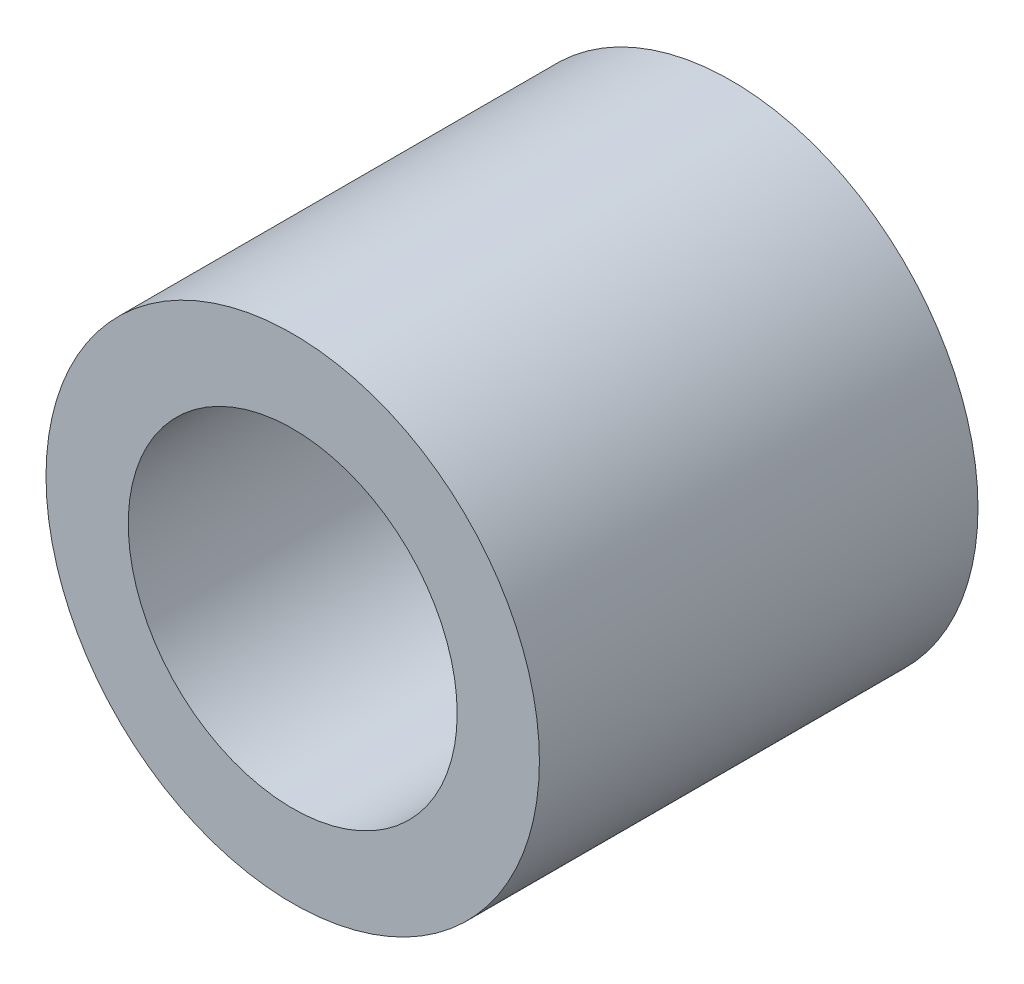
ISO-10303-21;
HEADER;
FILE_DESCRIPTION(('STEP AP214'),'2;1');
FILE_NAME('part.step','',(''),(''),'','','');
FILE_SCHEMA(('AUTOMOTIVE_DESIGN { 1 0 10303 214 1 1 1 1 }'));
ENDSEC;
DATA;
#1=APPLICATION_CONTEXT('core data for automotive mechanical design processes');
#2=APPLICATION_PROTOCOL_DEFINITION('international standard','automotive_design',2000,#1);
#3=PRODUCT_CONTEXT('',#1,'mechanical');
#4=PRODUCT('Part','Part','',(#3));
#5=PRODUCT_RELATED_PRODUCT_CATEGORY('part','',(#4));
#6=PRODUCT_DEFINITION_FORMATION('','',#4);
#7=PRODUCT_DEFINITION_CONTEXT('part definition',#1,'design');
#8=PRODUCT_DEFINITION('design','',#6,#7);
#9=PRODUCT_DEFINITION_SHAPE('','',#8);
#10=(LENGTH_UNIT() NAMED_UNIT(*) SI_UNIT(.MILLI.,.METRE.));
#11=(NAMED_UNIT(*) PLANE_ANGLE_UNIT() SI_UNIT($,.RADIAN.));
#12=(NAMED_UNIT(*) SI_UNIT($,.STERADIAN.) SOLID_ANGLE_UNIT());
#13=UNCERTAINTY_MEASURE_WITH_UNIT(LENGTH_MEASURE(1.E-05),#10,'distance_accuracy_value','');
#14=(GEOMETRIC_REPRESENTATION_CONTEXT(3) GLOBAL_UNCERTAINTY_ASSIGNED_CONTEXT((#13)) GLOBAL_UNIT_ASSIGNED_CONTEXT((#10,
#11,#12)) REPRESENTATION_CONTEXT('',''));
#15=CARTESIAN_POINT('',(0.,0.,0.));
#16=DIRECTION('',(0.,0.,1.));
#17=DIRECTION('',(1.,0.,0.));
#18=AXIS2_PLACEMENT_3D('',#15,#16,#17);
#19=CARTESIAN_POINT('',(0.,0.,0.));
#20=DIRECTION('',(0.,0.,1.));
#21=DIRECTION('',(1.,0.,0.));
#22=AXIS2_PLACEMENT_3D('',#19,#20,#21);
#23=CYLINDRICAL_SURFACE('',#22,6.);
#24=CARTESIAN_POINT('',(0.,0.,16.));
#25=DIRECTION('',(0.,0.,1.));
#26=DIRECTION('',(1.,0.,0.));
#27=AXIS2_PLACEMENT_3D('',#24,#25,#26);
#28=CIRCLE('',#27,6.);
#29=CARTESIAN_POINT('',(6.,0.,16.));
#30=VERTEX_POINT('',#29);
#31=EDGE_CURVE('E18',#30,#30,#28,.F.);
#32=ORIENTED_EDGE('',*,*,#31,.F.);
#33=EDGE_LOOP('',(#32));
#34=FACE_BOUND('',#33,.T.);
#35=CARTESIAN_POINT('',(0.,0.,0.));
#36=DIRECTION('',(0.,0.,1.));
#37=DIRECTION('',(1.,0.,0.));
#38=AXIS2_PLACEMENT_3D('',#35,#36,#37);
#39=CIRCLE('',#38,6.);
#40=CARTESIAN_POINT('',(6.,0.,0.));
#41=VERTEX_POINT('',#40);
#42=EDGE_CURVE('E27',#41,#41,#39,.F.);
#43=ORIENTED_EDGE('',*,*,#42,.T.);
#44=EDGE_LOOP('',(#43));
#45=FACE_BOUND('',#44,.T.);
#46=ADVANCED_FACE('F15',(#34,#45),#23,.F.);
#47=CARTESIAN_POINT('',(0.,0.,16.));
#48=DIRECTION('',(0.,0.,1.));
#49=DIRECTION('',(1.,0.,0.));
#50=AXIS2_PLACEMENT_3D('',#47,#48,#49);
#51=PLANE('',#50);
#52=ORIENTED_EDGE('',*,*,#31,.T.);
#53=EDGE_LOOP('',(#52));
#54=FACE_BOUND('',#53,.T.);
#55=CARTESIAN_POINT('',(0.,0.,16.));
#56=DIRECTION('',(0.,0.,1.));
#57=DIRECTION('',(1.,0.,0.));
#58=AXIS2_PLACEMENT_3D('',#55,#56,#57);
#59=CIRCLE('',#58,9.);
#60=CARTESIAN_POINT('',(9.,0.,16.));
#61=VERTEX_POINT('',#60);
#62=EDGE_CURVE('E22',#61,#61,#59,.F.);
#63=ORIENTED_EDGE('',*,*,#62,.F.);
#64=EDGE_LOOP('',(#63));
#65=FACE_BOUND('',#64,.T.);
#66=ADVANCED_FACE('F35',(#54,#65),#51,.T.);
#67=CARTESIAN_POINT('',(0.,0.,0.));
#68=DIRECTION('',(0.,0.,1.));
#69=DIRECTION('',(1.,0.,0.));
#70=AXIS2_PLACEMENT_3D('',#67,#68,#69);
#71=PLANE('',#70);
#72=ORIENTED_EDGE('',*,*,#42,.F.);
#73=EDGE_LOOP('',(#72));
#74=FACE_BOUND('',#73,.T.);
#75=CARTESIAN_POINT('',(0.,0.,0.));
#76=DIRECTION('',(0.,0.,1.));
#77=DIRECTION('',(1.,0.,0.));
#78=AXIS2_PLACEMENT_3D('',#75,#76,#77);
#79=CIRCLE('',#78,9.);
#80=CARTESIAN_POINT('',(9.,0.,0.));
#81=VERTEX_POINT('',#80);
#82=EDGE_CURVE('E10',#81,#81,#79,.T.);
#83=ORIENTED_EDGE('',*,*,#82,.F.);
#84=EDGE_LOOP('',(#83));
#85=FACE_BOUND('',#84,.T.);
#86=ADVANCED_FACE('F43',(#74,#85),#71,.F.);
#87=CARTESIAN_POINT('',(0.,0.,0.));
#88=DIRECTION('',(0.,0.,1.));
#89=DIRECTION('',(1.,0.,0.));
#90=AXIS2_PLACEMENT_3D('',#87,#88,#89);
#91=CYLINDRICAL_SURFACE('',#90,9.);
#92=ORIENTED_EDGE('',*,*,#62,.T.);
#93=EDGE_LOOP('',(#92));
#94=FACE_BOUND('',#93,.T.);
#95=ORIENTED_EDGE('',*,*,#82,.T.);
#96=EDGE_LOOP('',(#95));
#97=FACE_BOUND('',#96,.T.);
#98=ADVANCED_FACE('F44',(#94,#97),#91,.T.);
#99=CLOSED_SHELL('',(#46,#66,#86,#98));
#100=MANIFOLD_SOLID_BREP('B1',#99);
#101=ADVANCED_BREP_SHAPE_REPRESENTATION('',(#18,#100),#14);
#102=SHAPE_DEFINITION_REPRESENTATION(#9,#101);
ENDSEC;
END-ISO-10303-21;
